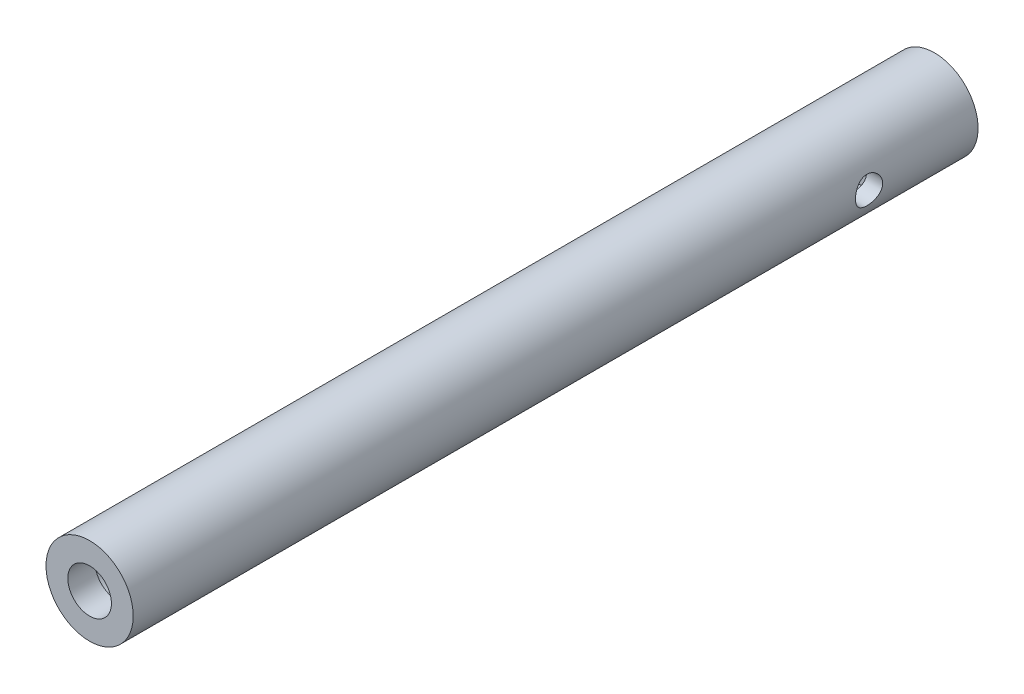
ISO-10303-21;
HEADER;
FILE_DESCRIPTION(('STEP AP214'),'2;1');
FILE_NAME('part.step','',(''),(''),'','','');
FILE_SCHEMA(('AUTOMOTIVE_DESIGN { 1 0 10303 214 1 1 1 1 }'));
ENDSEC;
DATA;
#1=APPLICATION_CONTEXT('core data for automotive mechanical design processes');
#2=APPLICATION_PROTOCOL_DEFINITION('international standard','automotive_design',2000,#1);
#3=PRODUCT_CONTEXT('',#1,'mechanical');
#4=PRODUCT('Part','Part','',(#3));
#5=PRODUCT_RELATED_PRODUCT_CATEGORY('part','',(#4));
#6=PRODUCT_DEFINITION_FORMATION('','',#4);
#7=PRODUCT_DEFINITION_CONTEXT('part definition',#1,'design');
#8=PRODUCT_DEFINITION('design','',#6,#7);
#9=PRODUCT_DEFINITION_SHAPE('','',#8);
#10=(LENGTH_UNIT() NAMED_UNIT(*) SI_UNIT(.MILLI.,.METRE.));
#11=(NAMED_UNIT(*) PLANE_ANGLE_UNIT() SI_UNIT($,.RADIAN.));
#12=(NAMED_UNIT(*) SI_UNIT($,.STERADIAN.) SOLID_ANGLE_UNIT());
#13=UNCERTAINTY_MEASURE_WITH_UNIT(LENGTH_MEASURE(1.E-05),#10,'distance_accuracy_value','');
#14=(GEOMETRIC_REPRESENTATION_CONTEXT(3) GLOBAL_UNCERTAINTY_ASSIGNED_CONTEXT((#13)) GLOBAL_UNIT_ASSIGNED_CONTEXT((#10,
#11,#12)) REPRESENTATION_CONTEXT('',''));
#15=CARTESIAN_POINT('',(0.,0.,0.));
#16=DIRECTION('',(0.,0.,1.));
#17=DIRECTION('',(1.,0.,0.));
#18=AXIS2_PLACEMENT_3D('',#15,#16,#17);
#19=CARTESIAN_POINT('',(0.,0.,150.));
#20=DIRECTION('',(0.,0.,-1.));
#21=DIRECTION('',(-1.,0.,0.));
#22=AXIS2_PLACEMENT_3D('',#19,#20,#21);
#23=CYLINDRICAL_SURFACE('',#22,8.);
#24=CARTESIAN_POINT('',(-8.,0.,12.5));
#25=CARTESIAN_POINT('',(-7.9999993175598,0.136878370349092,12.5000008931751));
#26=CARTESIAN_POINT('',(-7.99645389969682,0.273766105005718,12.5112784538889));
#27=CARTESIAN_POINT('',(-7.98265788177613,0.543538419176896,12.5559724830785));
#28=CARTESIAN_POINT('',(-7.97240576399719,0.676422085451814,12.5893939627287));
#29=CARTESIAN_POINT('',(-7.94631631395819,0.934257087301612,12.6771387423915));
#30=CARTESIAN_POINT('',(-7.9304876299805,1.05922035397161,12.7314296893059));
#31=CARTESIAN_POINT('',(-7.89487938322185,1.29826960469292,12.8592346353566));
#32=CARTESIAN_POINT('',(-7.8750991979981,1.41235387088977,12.9327516635612));
#33=CARTESIAN_POINT('',(-7.83300427480565,1.62993066990456,13.0993119840347));
#34=CARTESIAN_POINT('',(-7.81063431853978,1.73304005631332,13.1928417701221));
#35=CARTESIAN_POINT('',(-7.76620092748417,1.92239476407399,13.3957367848271));
#36=CARTESIAN_POINT('',(-7.74413755046914,2.00863694579739,13.5051049549891));
#37=CARTESIAN_POINT('',(-7.70222289396344,2.16388672966227,13.7398891276161));
#38=CARTESIAN_POINT('',(-7.68243976603591,2.23241568300258,13.8656349550544));
#39=CARTESIAN_POINT('',(-7.64815603598468,2.34719482153343,14.1275846299637));
#40=CARTESIAN_POINT('',(-7.63365404257377,2.39345087543889,14.2637857115878));
#41=CARTESIAN_POINT('',(-7.61215213969001,2.46096919860067,14.5384561549041));
#42=CARTESIAN_POINT('',(-7.60493945859017,2.48294220015729,14.6767336872777));
#43=CARTESIAN_POINT('',(-7.59820110281901,2.50349110073976,14.9551862378238));
#44=CARTESIAN_POINT('',(-7.59867338454668,2.50207321991544,15.0953607416433));
#45=CARTESIAN_POINT('',(-7.60706378150876,2.47643649465479,15.367748920538));
#46=CARTESIAN_POINT('',(-7.61468683491897,2.45312115738766,15.5000582517231));
#47=CARTESIAN_POINT('',(-7.63604051304978,2.38581626711252,15.7587843130747));
#48=CARTESIAN_POINT('',(-7.6497717868623,2.34182451689101,15.8852004154176));
#49=CARTESIAN_POINT('',(-7.68202088028593,2.23377749362554,16.1307038888653));
#50=CARTESIAN_POINT('',(-7.70060569321649,2.16943851324164,16.2496572213839));
#51=CARTESIAN_POINT('',(-7.7404371316014,2.02272041475696,16.4753755357582));
#52=CARTESIAN_POINT('',(-7.76168444789102,1.94033661043154,16.5821373405074));
#53=CARTESIAN_POINT('',(-7.80563055600986,1.75543390836425,16.785549886834));
#54=CARTESIAN_POINT('',(-7.82835139211391,1.65216914118563,16.8815191155593));
#55=CARTESIAN_POINT('',(-7.87183141519161,1.43072881619106,17.0549437871593));
#56=CARTESIAN_POINT('',(-7.89259045676745,1.31255215469804,17.1323978584384));
#57=CARTESIAN_POINT('',(-7.93002589780382,1.06332922093091,17.2670553772025));
#58=CARTESIAN_POINT('',(-7.94666921296415,0.932189813838559,17.3240962709279));
#59=CARTESIAN_POINT('',(-7.97375911657108,0.661535955565289,17.4151060017031));
#60=CARTESIAN_POINT('',(-7.98420758650304,0.522024061449217,17.4490818444768));
#61=CARTESIAN_POINT('',(-7.99742778790027,0.24437031458069,17.4918360851579));
#62=CARTESIAN_POINT('',(-8.00048045790873,0.106383697577686,17.501537087187));
#63=CARTESIAN_POINT('',(-7.99939599461967,-0.169260611465171,17.4980675467253));
#64=CARTESIAN_POINT('',(-7.9952599116227,-0.306918348613018,17.4849003453548));
#65=CARTESIAN_POINT('',(-7.98044727539523,-0.574438665951698,17.4368088147872));
#66=CARTESIAN_POINT('',(-7.96993586221374,-0.704409956841874,17.402433464775));
#67=CARTESIAN_POINT('',(-7.94360242758579,-0.956703857722754,17.3135712952665));
#68=CARTESIAN_POINT('',(-7.92777975028687,-1.07902552089812,17.25908199195));
#69=CARTESIAN_POINT('',(-7.89197085518848,-1.31586481334438,17.1300535669026));
#70=CARTESIAN_POINT('',(-7.87189253635335,-1.43011947957558,17.0550580250064));
#71=CARTESIAN_POINT('',(-7.82986820006859,-1.64473170192052,16.8876935797651));
#72=CARTESIAN_POINT('',(-7.80792167695774,-1.7450854760879,16.7953199645107));
#73=CARTESIAN_POINT('',(-7.76353989766283,-1.93317492583804,16.5914822198958));
#74=CARTESIAN_POINT('',(-7.74111973412883,-2.02025304679063,16.4794066725215));
#75=CARTESIAN_POINT('',(-7.69923894191212,-2.17442500490303,16.2417467672464));
#76=CARTESIAN_POINT('',(-7.67977826622621,-2.24151915946859,16.116162623946));
#77=CARTESIAN_POINT('',(-7.64623564661738,-2.35340166961085,15.855309654259));
#78=CARTESIAN_POINT('',(-7.63213292713749,-2.39827639112025,15.7200807011285));
#79=CARTESIAN_POINT('',(-7.6110234168862,-2.4644578863618,15.4434550135027));
#80=CARTESIAN_POINT('',(-7.60401392602456,-2.48577362827989,15.3020606473129));
#81=CARTESIAN_POINT('',(-7.59816585427753,-2.50358812316251,15.0239918248391));
#82=CARTESIAN_POINT('',(-7.59897209200284,-2.50116559243271,14.8873930923051));
#83=CARTESIAN_POINT('',(-7.60780180751807,-2.47417636257668,14.6166508301161));
#84=CARTESIAN_POINT('',(-7.61582494863208,-2.44961069645024,14.4825071862265));
#85=CARTESIAN_POINT('',(-7.6379362836678,-2.37975459827235,14.2224119208162));
#86=CARTESIAN_POINT('',(-7.65193396380513,-2.33477284812017,14.0963691178133));
#87=CARTESIAN_POINT('',(-7.68439408509128,-2.22560454669999,13.853519172932));
#88=CARTESIAN_POINT('',(-7.70285743429343,-2.16141408888474,13.7367139158432));
#89=CARTESIAN_POINT('',(-7.74306974067005,-2.01271350026987,13.5107080591204));
#90=CARTESIAN_POINT('',(-7.76491897845913,-1.92750667048265,13.4019837409995));
#91=CARTESIAN_POINT('',(-7.8089799764242,-1.7404179928096,13.200027343776));
#92=CARTESIAN_POINT('',(-7.83119183213309,-1.63853168468878,13.1067994220179));
#93=CARTESIAN_POINT('',(-7.87434543904947,-1.41697332564669,12.9354349232741));
#94=CARTESIAN_POINT('',(-7.89522203461346,-1.29682914897477,12.8578905271001));
#95=CARTESIAN_POINT('',(-7.93253538593756,-1.0445582760273,12.7242021697211));
#96=CARTESIAN_POINT('',(-7.94897388631644,-0.912436315590897,12.6680497957163));
#97=CARTESIAN_POINT('',(-7.97441301466941,-0.651495270747958,12.5828172647831));
#98=CARTESIAN_POINT('',(-7.98392481612283,-0.523340674225093,12.5518502653893));
#99=CARTESIAN_POINT('',(-7.99671800680967,-0.263459790880496,12.5104432800646));
#100=CARTESIAN_POINT('',(-8.00000065679286,-0.13173423227935,12.499999140392));
#101=CARTESIAN_POINT('',(-8.,0.,12.5));
#102=B_SPLINE_CURVE_WITH_KNOTS('',3,(#24,#25,#26,#27,#28,#29,#30,#31,#32,#33,#34,#35,#36,#37,
#38,#39,#40,#41,#42,#43,#44,#45,#46,#47,#48,#49,#50,#51,#52,#53,#54,#55,#56,#57,#58,#59,#60,#61,
#62,#63,#64,#65,#66,#67,#68,#69,#70,#71,#72,#73,#74,#75,#76,#77,#78,#79,#80,#81,#82,#83,#84,#85,
#86,#87,#88,#89,#90,#91,#92,#93,#94,#95,#96,#97,#98,#99,#100,#101),.UNSPECIFIED.,.T.,.F.,(4,2,2,
2,2,2,2,2,2,2,2,2,2,2,2,2,2,2,2,2,2,2,2,2,2,2,2,2,2,2,2,2,2,2,2,2,2,2,4),(0.,0.41015089886502,
0.820394646698132,1.23000495840487,1.63967984311678,2.06075644390316,2.48191134862552,
2.91347542494988,3.34492572559054,3.7633830033442,4.18172900590277,4.58353834844339,
4.98539039958126,5.39311285441091,5.80094132020717,6.22733494559201,6.65376014826607,
7.0835092137954,7.51312768989108,7.92615137096475,8.33911471298726,8.74181253445744,
9.14456010069,9.55712649476687,9.96980491418519,10.3988355742628,10.8278594196742,
11.2552023150671,11.6823824779468,12.0902440696666,12.4980866352126,12.8999582681244,
13.3019116867944,13.7195902803182,14.1373807476578,14.5688133627192,15.0000761335177,
15.3948927332218,15.7896294154519),.UNSPECIFIED.);
#103=CARTESIAN_POINT('',(-8.,0.,12.5));
#104=VERTEX_POINT('',#103);
#105=EDGE_CURVE('E81',#104,#104,#102,.T.);
#106=ORIENTED_EDGE('',*,*,#105,.T.);
#107=EDGE_LOOP('',(#106));
#108=FACE_BOUND('',#107,.T.);
#109=CARTESIAN_POINT('',(8.,0.,12.5));
#110=CARTESIAN_POINT('',(7.9999993175598,-0.136878370349093,12.5000008931751));
#111=CARTESIAN_POINT('',(7.99645389969682,-0.273766105005718,12.5112784538889));
#112=CARTESIAN_POINT('',(7.98265788177613,-0.543538419176896,12.5559724830785));
#113=CARTESIAN_POINT('',(7.97240576399719,-0.676422085451814,12.5893939627287));
#114=CARTESIAN_POINT('',(7.94631631395819,-0.934257087301613,12.6771387423915));
#115=CARTESIAN_POINT('',(7.9304876299805,-1.05922035397161,12.7314296893059));
#116=CARTESIAN_POINT('',(7.89487938322185,-1.29826960469292,12.8592346353566));
#117=CARTESIAN_POINT('',(7.8750991979981,-1.41235387088977,12.9327516635612));
#118=CARTESIAN_POINT('',(7.83300427480565,-1.62993066990456,13.0993119840347));
#119=CARTESIAN_POINT('',(7.81063431853978,-1.73304005631332,13.1928417701221));
#120=CARTESIAN_POINT('',(7.76620092748417,-1.92239476407399,13.3957367848271));
#121=CARTESIAN_POINT('',(7.74413755046914,-2.00863694579739,13.5051049549891));
#122=CARTESIAN_POINT('',(7.70222289396344,-2.16388672966227,13.7398891276161));
#123=CARTESIAN_POINT('',(7.68243976603591,-2.23241568300258,13.8656349550544));
#124=CARTESIAN_POINT('',(7.64815603598468,-2.34719482153343,14.1275846299637));
#125=CARTESIAN_POINT('',(7.63365404257377,-2.39345087543889,14.2637857115878));
#126=CARTESIAN_POINT('',(7.61215213969001,-2.46096919860067,14.5384561549041));
#127=CARTESIAN_POINT('',(7.60493945859016,-2.48294220015729,14.6767336872777));
#128=CARTESIAN_POINT('',(7.59820110281901,-2.50349110073976,14.9551862378238));
#129=CARTESIAN_POINT('',(7.59867338454668,-2.50207321991544,15.0953607416433));
#130=CARTESIAN_POINT('',(7.60706378150876,-2.47643649465479,15.3677489205379));
#131=CARTESIAN_POINT('',(7.61468683491897,-2.45312115738766,15.5000582517231));
#132=CARTESIAN_POINT('',(7.63604051304978,-2.38581626711252,15.7587843130747));
#133=CARTESIAN_POINT('',(7.64977178686229,-2.34182451689101,15.8852004154176));
#134=CARTESIAN_POINT('',(7.68202088028593,-2.23377749362555,16.1307038888653));
#135=CARTESIAN_POINT('',(7.70060569321649,-2.16943851324164,16.2496572213839));
#136=CARTESIAN_POINT('',(7.7404371316014,-2.02272041475697,16.4753755357582));
#137=CARTESIAN_POINT('',(7.76168444789102,-1.94033661043155,16.5821373405074));
#138=CARTESIAN_POINT('',(7.80563055600986,-1.75543390836425,16.785549886834));
#139=CARTESIAN_POINT('',(7.82835139211391,-1.65216914118564,16.8815191155593));
#140=CARTESIAN_POINT('',(7.8718314151916,-1.43072881619106,17.0549437871593));
#141=CARTESIAN_POINT('',(7.89259045676745,-1.31255215469804,17.1323978584384));
#142=CARTESIAN_POINT('',(7.93002589780382,-1.06332922093091,17.2670553772025));
#143=CARTESIAN_POINT('',(7.94666921296415,-0.932189813838562,17.3240962709279));
#144=CARTESIAN_POINT('',(7.97375911657108,-0.661535955565292,17.4151060017031));
#145=CARTESIAN_POINT('',(7.98420758650304,-0.522024061449221,17.4490818444768));
#146=CARTESIAN_POINT('',(7.99742778790027,-0.244370314580693,17.4918360851579));
#147=CARTESIAN_POINT('',(8.00048045790873,-0.106383697577689,17.501537087187));
#148=CARTESIAN_POINT('',(7.99939599461967,0.169260611465169,17.4980675467253));
#149=CARTESIAN_POINT('',(7.9952599116227,0.306918348613015,17.4849003453548));
#150=CARTESIAN_POINT('',(7.98044727539523,0.574438665951695,17.4368088147872));
#151=CARTESIAN_POINT('',(7.96993586221374,0.704409956841872,17.402433464775));
#152=CARTESIAN_POINT('',(7.94360242758579,0.956703857722752,17.3135712952666));
#153=CARTESIAN_POINT('',(7.92777975028687,1.07902552089811,17.25908199195));
#154=CARTESIAN_POINT('',(7.89197085518848,1.31586481334437,17.1300535669026));
#155=CARTESIAN_POINT('',(7.87189253635335,1.43011947957558,17.0550580250064));
#156=CARTESIAN_POINT('',(7.82986820006859,1.64473170192052,16.8876935797651));
#157=CARTESIAN_POINT('',(7.80792167695774,1.7450854760879,16.7953199645107));
#158=CARTESIAN_POINT('',(7.76353989766283,1.93317492583804,16.5914822198958));
#159=CARTESIAN_POINT('',(7.74111973412883,2.02025304679062,16.4794066725215));
#160=CARTESIAN_POINT('',(7.69923894191212,2.17442500490303,16.2417467672464));
#161=CARTESIAN_POINT('',(7.67977826622621,2.24151915946859,16.116162623946));
#162=CARTESIAN_POINT('',(7.64623564661738,2.35340166961084,15.855309654259));
#163=CARTESIAN_POINT('',(7.63213292713749,2.39827639112025,15.7200807011285));
#164=CARTESIAN_POINT('',(7.6110234168862,2.4644578863618,15.4434550135027));
#165=CARTESIAN_POINT('',(7.60401392602456,2.48577362827989,15.3020606473129));
#166=CARTESIAN_POINT('',(7.59816585427753,2.50358812316251,15.0239918248391));
#167=CARTESIAN_POINT('',(7.59897209200284,2.50116559243271,14.8873930923051));
#168=CARTESIAN_POINT('',(7.60780180751807,2.47417636257668,14.6166508301161));
#169=CARTESIAN_POINT('',(7.61582494863208,2.44961069645024,14.4825071862265));
#170=CARTESIAN_POINT('',(7.6379362836678,2.37975459827235,14.2224119208162));
#171=CARTESIAN_POINT('',(7.65193396380513,2.33477284812017,14.0963691178133));
#172=CARTESIAN_POINT('',(7.68439408509128,2.22560454669999,13.853519172932));
#173=CARTESIAN_POINT('',(7.70285743429343,2.16141408888474,13.7367139158432));
#174=CARTESIAN_POINT('',(7.74306974067005,2.01271350026987,13.5107080591204));
#175=CARTESIAN_POINT('',(7.76491897845913,1.92750667048265,13.4019837409995));
#176=CARTESIAN_POINT('',(7.8089799764242,1.7404179928096,13.200027343776));
#177=CARTESIAN_POINT('',(7.83119183213309,1.63853168468878,13.1067994220179));
#178=CARTESIAN_POINT('',(7.87434543904947,1.41697332564669,12.9354349232741));
#179=CARTESIAN_POINT('',(7.89522203461346,1.29682914897477,12.8578905271001));
#180=CARTESIAN_POINT('',(7.93253538593756,1.0445582760273,12.7242021697211));
#181=CARTESIAN_POINT('',(7.94897388631644,0.912436315590897,12.6680497957163));
#182=CARTESIAN_POINT('',(7.97441301466941,0.651495270747957,12.5828172647831));
#183=CARTESIAN_POINT('',(7.98392481612283,0.523340674225092,12.5518502653893));
#184=CARTESIAN_POINT('',(7.99671800680967,0.263459790880495,12.5104432800646));
#185=CARTESIAN_POINT('',(8.00000065679286,0.131734232279349,12.499999140392));
#186=CARTESIAN_POINT('',(8.,0.,12.5));
#187=B_SPLINE_CURVE_WITH_KNOTS('',3,(#109,#110,#111,#112,#113,#114,#115,#116,#117,#118,#119,
#120,#121,#122,#123,#124,#125,#126,#127,#128,#129,#130,#131,#132,#133,#134,#135,#136,#137,#138,
#139,#140,#141,#142,#143,#144,#145,#146,#147,#148,#149,#150,#151,#152,#153,#154,#155,#156,#157,
#158,#159,#160,#161,#162,#163,#164,#165,#166,#167,#168,#169,#170,#171,#172,#173,#174,#175,#176,
#177,#178,#179,#180,#181,#182,#183,#184,#185,#186),.UNSPECIFIED.,.T.,.F.,(4,2,2,2,2,2,2,2,2,2,2,
2,2,2,2,2,2,2,2,2,2,2,2,2,2,2,2,2,2,2,2,2,2,2,2,2,2,2,4),(0.,0.41015089886502,0.820394646698133,
1.23000495840487,1.63967984311678,2.06075644390317,2.48191134862552,2.91347542494988,
3.34492572559054,3.7633830033442,4.18172900590277,4.58353834844338,4.98539039958126,
5.3931128544109,5.80094132020717,6.227334945592,6.65376014826606,7.0835092137954,
7.51312768989108,7.92615137096475,8.33911471298726,8.74181253445744,9.14456010069,
9.55712649476687,9.96980491418519,10.3988355742628,10.8278594196742,11.2552023150671,
11.6823824779468,12.0902440696666,12.4980866352126,12.8999582681244,13.3019116867944,
13.7195902803182,14.1373807476578,14.5688133627192,15.0000761335177,15.3948927332218,
15.7896294154519),.UNSPECIFIED.);
#188=CARTESIAN_POINT('',(8.,0.,12.5));
#189=VERTEX_POINT('',#188);
#190=EDGE_CURVE('E76',#189,#189,#187,.T.);
#191=ORIENTED_EDGE('',*,*,#190,.T.);
#192=EDGE_LOOP('',(#191));
#193=FACE_BOUND('',#192,.T.);
#194=CARTESIAN_POINT('',(0.,0.,150.));
#195=DIRECTION('',(0.,0.,1.));
#196=DIRECTION('',(1.,0.,0.));
#197=AXIS2_PLACEMENT_3D('',#194,#195,#196);
#198=CIRCLE('',#197,8.);
#199=CARTESIAN_POINT('',(8.,0.,150.));
#200=VERTEX_POINT('',#199);
#201=EDGE_CURVE('E10',#200,#200,#198,.T.);
#202=ORIENTED_EDGE('',*,*,#201,.F.);
#203=EDGE_LOOP('',(#202));
#204=FACE_BOUND('',#203,.T.);
#205=CARTESIAN_POINT('',(0.,0.,-5.));
#206=DIRECTION('',(0.,0.,-1.));
#207=DIRECTION('',(-1.,0.,0.));
#208=AXIS2_PLACEMENT_3D('',#205,#206,#207);
#209=CIRCLE('',#208,8.);
#210=CARTESIAN_POINT('',(-8.,0.,-5.));
#211=VERTEX_POINT('',#210);
#212=EDGE_CURVE('E56',#211,#211,#209,.T.);
#213=ORIENTED_EDGE('',*,*,#212,.F.);
#214=EDGE_LOOP('',(#213));
#215=FACE_BOUND('',#214,.T.);
#216=ADVANCED_FACE('F32',(#108,#193,#204,#215),#23,.T.);
#217=CARTESIAN_POINT('',(0.,0.,150.));
#218=DIRECTION('',(0.,0.,1.));
#219=DIRECTION('',(1.,0.,0.));
#220=AXIS2_PLACEMENT_3D('',#217,#218,#219);
#221=PLANE('',#220);
#222=CARTESIAN_POINT('',(0.,0.,150.));
#223=DIRECTION('',(0.,0.,1.));
#224=DIRECTION('',(1.,0.,0.));
#225=AXIS2_PLACEMENT_3D('',#222,#223,#224);
#226=CIRCLE('',#225,4.);
#227=CARTESIAN_POINT('',(4.,0.,150.));
#228=VERTEX_POINT('',#227);
#229=EDGE_CURVE('E44',#228,#228,#226,.T.);
#230=ORIENTED_EDGE('',*,*,#229,.F.);
#231=EDGE_LOOP('',(#230));
#232=FACE_BOUND('',#231,.T.);
#233=ORIENTED_EDGE('',*,*,#201,.T.);
#234=EDGE_LOOP('',(#233));
#235=FACE_BOUND('',#234,.T.);
#236=ADVANCED_FACE('F106',(#232,#235),#221,.T.);
#237=CARTESIAN_POINT('',(0.,0.,145.));
#238=DIRECTION('',(0.,0.,1.));
#239=DIRECTION('',(1.,0.,0.));
#240=AXIS2_PLACEMENT_3D('',#237,#238,#239);
#241=CYLINDRICAL_SURFACE('',#240,4.);
#242=CARTESIAN_POINT('',(0.,0.,145.));
#243=DIRECTION('',(0.,0.,1.));
#244=DIRECTION('',(1.,0.,0.));
#245=AXIS2_PLACEMENT_3D('',#242,#243,#244);
#246=CIRCLE('',#245,4.);
#247=CARTESIAN_POINT('',(4.,0.,145.));
#248=VERTEX_POINT('',#247);
#249=EDGE_CURVE('E49',#248,#248,#246,.F.);
#250=ORIENTED_EDGE('',*,*,#249,.T.);
#251=EDGE_LOOP('',(#250));
#252=FACE_BOUND('',#251,.T.);
#253=ORIENTED_EDGE('',*,*,#229,.T.);
#254=EDGE_LOOP('',(#253));
#255=FACE_BOUND('',#254,.T.);
#256=ADVANCED_FACE('F95',(#252,#255),#241,.F.);
#257=CARTESIAN_POINT('',(0.,0.,145.));
#258=DIRECTION('',(0.,0.,1.));
#259=DIRECTION('',(1.,0.,0.));
#260=AXIS2_PLACEMENT_3D('',#257,#258,#259);
#261=PLANE('',#260);
#262=CARTESIAN_POINT('',(0.,0.,145.));
#263=DIRECTION('',(0.,0.,1.));
#264=DIRECTION('',(1.,0.,0.));
#265=AXIS2_PLACEMENT_3D('',#262,#263,#264);
#266=CIRCLE('',#265,5.);
#267=CARTESIAN_POINT('',(5.,0.,145.));
#268=VERTEX_POINT('',#267);
#269=EDGE_CURVE('E87',#268,#268,#266,.T.);
#270=ORIENTED_EDGE('',*,*,#269,.F.);
#271=EDGE_LOOP('',(#270));
#272=FACE_BOUND('',#271,.T.);
#273=ORIENTED_EDGE('',*,*,#249,.F.);
#274=EDGE_LOOP('',(#273));
#275=FACE_BOUND('',#274,.T.);
#276=ADVANCED_FACE('F98',(#272,#275),#261,.F.);
#277=CARTESIAN_POINT('',(0.,0.,9.99999999999998));
#278=DIRECTION('',(0.,0.,1.));
#279=DIRECTION('',(1.,0.,0.));
#280=AXIS2_PLACEMENT_3D('',#277,#278,#279);
#281=CYLINDRICAL_SURFACE('',#280,5.);
#282=CARTESIAN_POINT('',(5.,0.,12.5));
#283=CARTESIAN_POINT('',(4.99999177550472,0.131426682334305,12.500009669056));
#284=CARTESIAN_POINT('',(4.99476199135277,0.263015634437213,12.510425561774));
#285=CARTESIAN_POINT('',(4.9743541856102,0.522301454622883,12.551631821162));
#286=CARTESIAN_POINT('',(4.9591572718767,0.649990448564105,12.582460880925));
#287=CARTESIAN_POINT('',(4.92040690922477,0.897333631316203,12.6629846227188));
#288=CARTESIAN_POINT('',(4.89688595907259,1.01701694536277,12.7126059877827));
#289=CARTESIAN_POINT('',(4.84364443325827,1.24618160399671,12.8289265262518));
#290=CARTESIAN_POINT('',(4.81392434644421,1.3556637520377,12.8956243531451));
#291=CARTESIAN_POINT('',(4.74890645050632,1.56876952630998,13.0487931316426));
#292=CARTESIAN_POINT('',(4.71337997659091,1.67163802294308,13.1362162002298));
#293=CARTESIAN_POINT('',(4.64149925776731,1.86194861703332,13.3263036959853));
#294=CARTESIAN_POINT('',(4.60514440566897,1.94937895911555,13.4289796288401));
#295=CARTESIAN_POINT('',(4.53247377945622,2.11312999967247,13.6562083744453));
#296=CARTESIAN_POINT('',(4.49637967412567,2.18806333849064,13.781840246035));
#297=CARTESIAN_POINT('',(4.43214946943555,2.31542056761491,14.0459183397954));
#298=CARTESIAN_POINT('',(4.40400769020792,2.36786053751682,14.1843553217626));
#299=CARTESIAN_POINT('',(4.36144667591402,2.44533110537653,14.4616627635964));
#300=CARTESIAN_POINT('',(4.34630678958452,2.47181464267578,14.6000111301796));
#301=CARTESIAN_POINT('',(4.3295472487215,2.50106748329741,14.8799470944376));
#302=CARTESIAN_POINT('',(4.3279142335843,2.50386022093906,15.0215313521751));
#303=CARTESIAN_POINT('',(4.33777325642937,2.48671821792512,15.2857150607909));
#304=CARTESIAN_POINT('',(4.34771909154984,2.46946139884055,15.4085600780583));
#305=CARTESIAN_POINT('',(4.37690571834675,2.41734962264384,15.6493047734319));
#306=CARTESIAN_POINT('',(4.39614947079454,2.38248905974454,15.7672028632631));
#307=CARTESIAN_POINT('',(4.44218691031839,2.29552445096459,15.9980728314143));
#308=CARTESIAN_POINT('',(4.46914601659993,2.24303766778987,16.1108659969645));
#309=CARTESIAN_POINT('',(4.52758510703513,2.12260421917012,16.326585731475));
#310=CARTESIAN_POINT('',(4.55906711950478,2.0546506095312,16.4295078390002));
#311=CARTESIAN_POINT('',(4.62782894758213,1.89516513728194,16.6363031318581));
#312=CARTESIAN_POINT('',(4.66533775591865,1.8017361459232,16.7386421839404));
#313=CARTESIAN_POINT('',(4.73869058251019,1.59888894685344,16.9268385464772));
#314=CARTESIAN_POINT('',(4.77453379897003,1.48946314143571,17.0126879800847));
#315=CARTESIAN_POINT('',(4.84254968207409,1.25129126457962,17.1692141525743));
#316=CARTESIAN_POINT('',(4.87447460405015,1.12188397899853,17.2390011811143));
#317=CARTESIAN_POINT('',(4.92894702803109,0.851165538721983,17.3552425726075));
#318=CARTESIAN_POINT('',(4.95150197358893,0.70986394066316,17.4017154625379));
#319=CARTESIAN_POINT('',(4.98310834353579,0.431916229151777,17.4661885092917));
#320=CARTESIAN_POINT('',(4.9931234575324,0.295853826370902,17.486228089367));
#321=CARTESIAN_POINT('',(5.00182533647794,0.0219489998732847,17.5036618278362));
#322=CARTESIAN_POINT('',(5.00051746803426,-0.115892549675113,17.5010667140985));
#323=CARTESIAN_POINT('',(4.98727980633468,-0.37808242996466,17.4744832789533));
#324=CARTESIAN_POINT('',(4.97618114219992,-0.50264852012371,17.4521686681756));
#325=CARTESIAN_POINT('',(4.94555428287529,-0.746017230755975,17.3894048202616));
#326=CARTESIAN_POINT('',(4.92602515837625,-0.864819214231886,17.3489535838641));
#327=CARTESIAN_POINT('',(4.87960628532329,-1.09722152111965,17.2500038339196));
#328=CARTESIAN_POINT('',(4.85252204417873,-1.21057599249831,17.1910223747177));
#329=CARTESIAN_POINT('',(4.7935993579975,-1.42615340426439,17.0572311608752));
#330=CARTESIAN_POINT('',(4.76175888940534,-1.52837157450204,16.9824146634801));
#331=CARTESIAN_POINT('',(4.69270553315086,-1.72941922315487,16.8105989367091));
#332=CARTESIAN_POINT('',(4.65527212009488,-1.82693019428496,16.7121428290248));
#333=CARTESIAN_POINT('',(4.58155978921587,-2.0046408025722,16.5001871219505));
#334=CARTESIAN_POINT('',(4.54528168472407,-2.08482846428685,16.3866772029301));
#335=CARTESIAN_POINT('',(4.4762798054528,-2.22926978618995,16.1408908645153));
#336=CARTESIAN_POINT('',(4.44381323981254,-2.29256373922244,16.0079718347088));
#337=CARTESIAN_POINT('',(4.38935180726746,-2.39520706511459,15.7312248311174));
#338=CARTESIAN_POINT('',(4.36734345549014,-2.43458729077056,15.587411184));
#339=CARTESIAN_POINT('',(4.33903752569351,-2.48465421767005,15.307724442637));
#340=CARTESIAN_POINT('',(4.33143458674096,-2.4977324874436,15.172414365881));
#341=CARTESIAN_POINT('',(4.32913386592579,-2.50172288950898,14.9013823326193));
#342=CARTESIAN_POINT('',(4.3344304902511,-2.49264462983266,14.7656605801263));
#343=CARTESIAN_POINT('',(4.35594655164663,-2.45481530197332,14.5112912443831));
#344=CARTESIAN_POINT('',(4.37107736338133,-2.42802074302696,14.3922488182792));
#345=CARTESIAN_POINT('',(4.40927540337602,-2.35793843840544,14.1604797078));
#346=CARTESIAN_POINT('',(4.43234518434965,-2.31464538728732,14.0477550684334));
#347=CARTESIAN_POINT('',(4.48571326433413,-2.20953919315538,13.8234378472803));
#348=CARTESIAN_POINT('',(4.5163930799845,-2.14667719009403,13.712430148265));
#349=CARTESIAN_POINT('',(4.58088327077455,-2.0053780838799,13.5018137567599));
#350=CARTESIAN_POINT('',(4.61469526970767,-1.92693287765888,13.4022110373713));
#351=CARTESIAN_POINT('',(4.68655816327011,-1.74550556946065,13.2046446362503));
#352=CARTESIAN_POINT('',(4.7246249151498,-1.64070022469209,13.1083506358286));
#353=CARTESIAN_POINT('',(4.79694347383545,-1.41539785420684,12.9343441505719));
#354=CARTESIAN_POINT('',(4.83119321905446,-1.29489242426332,12.8566416813941));
#355=CARTESIAN_POINT('',(4.89245149457782,-1.03978808878536,12.7219030205159));
#356=CARTESIAN_POINT('',(4.91940711437488,-0.905095560782286,12.6650168322155));
#357=CARTESIAN_POINT('',(4.95177960923351,-0.69632870925735,12.5978161412076));
#358=CARTESIAN_POINT('',(4.96122314081874,-0.625670413494086,12.5784446019982));
#359=CARTESIAN_POINT('',(4.97717127275101,-0.482623997839255,12.5459340516294));
#360=CARTESIAN_POINT('',(4.98367766823159,-0.410236963092399,12.5327912333236));
#361=CARTESIAN_POINT('',(4.9923820076613,-0.28151868462167,12.5152625277154));
#362=CARTESIAN_POINT('',(4.99523288466454,-0.225408499555443,12.5095450634687));
#363=CARTESIAN_POINT('',(4.99904367329659,-0.112875528456288,12.5019116705343));
#364=CARTESIAN_POINT('',(5.00000353273198,-0.0564527338382177,12.4999958467745));
#365=CARTESIAN_POINT('',(5.,0.,12.5));
#366=B_SPLINE_CURVE_WITH_KNOTS('',3,(#282,#283,#284,#285,#286,#287,#288,#289,#290,#291,#292,
#293,#294,#295,#296,#297,#298,#299,#300,#301,#302,#303,#304,#305,#306,#307,#308,#309,#310,#311,
#312,#313,#314,#315,#316,#317,#318,#319,#320,#321,#322,#323,#324,#325,#326,#327,#328,#329,#330,
#331,#332,#333,#334,#335,#336,#337,#338,#339,#340,#341,#342,#343,#344,#345,#346,#347,#348,#349,
#350,#351,#352,#353,#354,#355,#356,#357,#358,#359,#360,#361,#362,#363,#364,#365),.UNSPECIFIED.,
.T.,.F.,(4,2,2,2,2,2,2,2,2,2,2,2,2,2,2,2,2,2,2,2,2,2,2,2,2,2,2,2,2,2,2,2,2,2,2,2,2,2,2,2,2,4),
(0.,0.394060643550731,0.788870374272994,1.18215538873075,1.57540940145392,1.99245439679522,
2.40981559413509,2.85954316076882,3.30894869745702,3.73145030350574,4.15353393322551,
4.52514281023301,4.89687009814196,5.27725600421219,5.65781303150554,6.08662353334696,
6.51563836496716,6.96457555536101,7.41315542280699,7.82458226178364,8.2358141127869,
8.61517266265305,8.99457304077329,9.38482140069747,9.77523626870848,10.2039902661037,
10.6330397153795,11.0828670540368,11.53211279863,11.9382326875699,12.3441764966107,
12.7114482562151,13.0788382197025,13.4709114195009,13.8631890285845,14.303131068923,
14.7433095845248,15.1866003415819,15.407934939208,15.6291340766843,15.7983933645035,
15.9676573239322),.UNSPECIFIED.);
#367=CARTESIAN_POINT('',(5.,0.,12.5));
#368=VERTEX_POINT('',#367);
#369=EDGE_CURVE('E36',#368,#368,#366,.T.);
#370=ORIENTED_EDGE('',*,*,#369,.T.);
#371=EDGE_LOOP('',(#370));
#372=FACE_BOUND('',#371,.T.);
#373=CARTESIAN_POINT('',(-5.,0.,12.5));
#374=CARTESIAN_POINT('',(-4.99999177550472,-0.131426682334305,12.500009669056));
#375=CARTESIAN_POINT('',(-4.99476199135277,-0.263015634437213,12.510425561774));
#376=CARTESIAN_POINT('',(-4.9743541856102,-0.522301454622883,12.551631821162));
#377=CARTESIAN_POINT('',(-4.9591572718767,-0.649990448564106,12.582460880925));
#378=CARTESIAN_POINT('',(-4.92040690922477,-0.897333631316204,12.6629846227188));
#379=CARTESIAN_POINT('',(-4.89688595907259,-1.01701694536277,12.7126059877827));
#380=CARTESIAN_POINT('',(-4.84364443325827,-1.24618160399671,12.8289265262518));
#381=CARTESIAN_POINT('',(-4.81392434644421,-1.3556637520377,12.8956243531451));
#382=CARTESIAN_POINT('',(-4.74890645050632,-1.56876952630998,13.0487931316426));
#383=CARTESIAN_POINT('',(-4.71337997659091,-1.67163802294309,13.1362162002298));
#384=CARTESIAN_POINT('',(-4.64149925776731,-1.86194861703333,13.3263036959853));
#385=CARTESIAN_POINT('',(-4.60514440566897,-1.94937895911556,13.4289796288401));
#386=CARTESIAN_POINT('',(-4.53247377945622,-2.11312999967247,13.6562083744453));
#387=CARTESIAN_POINT('',(-4.49637967412567,-2.18806333849064,13.781840246035));
#388=CARTESIAN_POINT('',(-4.43214946943555,-2.31542056761491,14.0459183397954));
#389=CARTESIAN_POINT('',(-4.40400769020792,-2.36786053751682,14.1843553217626));
#390=CARTESIAN_POINT('',(-4.36144667591402,-2.44533110537653,14.4616627635964));
#391=CARTESIAN_POINT('',(-4.34630678958452,-2.47181464267578,14.6000111301796));
#392=CARTESIAN_POINT('',(-4.3295472487215,-2.50106748329741,14.8799470944376));
#393=CARTESIAN_POINT('',(-4.3279142335843,-2.50386022093906,15.0215313521751));
#394=CARTESIAN_POINT('',(-4.33777325642937,-2.48671821792512,15.2857150607909));
#395=CARTESIAN_POINT('',(-4.34771909154984,-2.46946139884055,15.4085600780583));
#396=CARTESIAN_POINT('',(-4.37690571834675,-2.41734962264384,15.6493047734319));
#397=CARTESIAN_POINT('',(-4.39614947079454,-2.38248905974454,15.7672028632631));
#398=CARTESIAN_POINT('',(-4.44218691031839,-2.29552445096459,15.9980728314143));
#399=CARTESIAN_POINT('',(-4.46914601659993,-2.24303766778987,16.1108659969645));
#400=CARTESIAN_POINT('',(-4.52758510703513,-2.12260421917012,16.326585731475));
#401=CARTESIAN_POINT('',(-4.55906711950478,-2.0546506095312,16.4295078390002));
#402=CARTESIAN_POINT('',(-4.62782894758213,-1.89516513728194,16.6363031318581));
#403=CARTESIAN_POINT('',(-4.66533775591865,-1.8017361459232,16.7386421839404));
#404=CARTESIAN_POINT('',(-4.73869058251019,-1.59888894685344,16.9268385464772));
#405=CARTESIAN_POINT('',(-4.77453379897003,-1.48946314143571,17.0126879800847));
#406=CARTESIAN_POINT('',(-4.84254968207409,-1.25129126457962,17.1692141525743));
#407=CARTESIAN_POINT('',(-4.87447460405015,-1.12188397899853,17.2390011811143));
#408=CARTESIAN_POINT('',(-4.92894702803109,-0.851165538721983,17.3552425726075));
#409=CARTESIAN_POINT('',(-4.95150197358893,-0.709863940663161,17.4017154625379));
#410=CARTESIAN_POINT('',(-4.98310834353579,-0.431916229151779,17.4661885092917));
#411=CARTESIAN_POINT('',(-4.9931234575324,-0.295853826370905,17.486228089367));
#412=CARTESIAN_POINT('',(-5.00182533647794,-0.0219489998732872,17.5036618278362));
#413=CARTESIAN_POINT('',(-5.00051746803426,0.11589254967511,17.5010667140985));
#414=CARTESIAN_POINT('',(-4.98727980633468,0.378082429964657,17.4744832789533));
#415=CARTESIAN_POINT('',(-4.97618114219992,0.502648520123707,17.4521686681756));
#416=CARTESIAN_POINT('',(-4.94555428287529,0.746017230755973,17.3894048202616));
#417=CARTESIAN_POINT('',(-4.92602515837625,0.864819214231884,17.3489535838641));
#418=CARTESIAN_POINT('',(-4.87960628532329,1.09722152111965,17.2500038339196));
#419=CARTESIAN_POINT('',(-4.85252204417873,1.21057599249831,17.1910223747177));
#420=CARTESIAN_POINT('',(-4.7935993579975,1.42615340426439,17.0572311608752));
#421=CARTESIAN_POINT('',(-4.76175888940534,1.52837157450203,16.9824146634801));
#422=CARTESIAN_POINT('',(-4.69270553315087,1.72941922315487,16.8105989367091));
#423=CARTESIAN_POINT('',(-4.65527212009488,1.82693019428496,16.7121428290248));
#424=CARTESIAN_POINT('',(-4.58155978921587,2.0046408025722,16.5001871219505));
#425=CARTESIAN_POINT('',(-4.54528168472407,2.08482846428685,16.3866772029301));
#426=CARTESIAN_POINT('',(-4.4762798054528,2.22926978618995,16.1408908645153));
#427=CARTESIAN_POINT('',(-4.44381323981254,2.29256373922243,16.0079718347088));
#428=CARTESIAN_POINT('',(-4.38935180726746,2.39520706511459,15.7312248311174));
#429=CARTESIAN_POINT('',(-4.36734345549014,2.43458729077055,15.587411184));
#430=CARTESIAN_POINT('',(-4.33903752569351,2.48465421767005,15.307724442637));
#431=CARTESIAN_POINT('',(-4.33143458674096,2.4977324874436,15.172414365881));
#432=CARTESIAN_POINT('',(-4.32913386592579,2.50172288950898,14.9013823326193));
#433=CARTESIAN_POINT('',(-4.33443049025111,2.49264462983266,14.7656605801264));
#434=CARTESIAN_POINT('',(-4.35594655164663,2.45481530197332,14.5112912443831));
#435=CARTESIAN_POINT('',(-4.37107736338133,2.42802074302696,14.3922488182792));
#436=CARTESIAN_POINT('',(-4.40927540337603,2.35793843840543,14.1604797078));
#437=CARTESIAN_POINT('',(-4.43234518434965,2.31464538728732,14.0477550684334));
#438=CARTESIAN_POINT('',(-4.48571326433413,2.20953919315538,13.8234378472803));
#439=CARTESIAN_POINT('',(-4.5163930799845,2.14667719009403,13.712430148265));
#440=CARTESIAN_POINT('',(-4.58088327077455,2.0053780838799,13.5018137567599));
#441=CARTESIAN_POINT('',(-4.61469526970767,1.92693287765888,13.4022110373713));
#442=CARTESIAN_POINT('',(-4.68655816327011,1.74550556946065,13.2046446362503));
#443=CARTESIAN_POINT('',(-4.7246249151498,1.6407002246921,13.1083506358286));
#444=CARTESIAN_POINT('',(-4.79694347383545,1.41539785420684,12.9343441505719));
#445=CARTESIAN_POINT('',(-4.83119321905446,1.29489242426332,12.8566416813941));
#446=CARTESIAN_POINT('',(-4.89245149457782,1.03978808878536,12.7219030205159));
#447=CARTESIAN_POINT('',(-4.91940711437488,0.905095560782287,12.6650168322155));
#448=CARTESIAN_POINT('',(-4.95177960923351,0.69632870925735,12.5978161412076));
#449=CARTESIAN_POINT('',(-4.96122314081874,0.625670413494086,12.5784446019982));
#450=CARTESIAN_POINT('',(-4.97717127275101,0.482623997839256,12.5459340516294));
#451=CARTESIAN_POINT('',(-4.98367766823159,0.4102369630924,12.5327912333236));
#452=CARTESIAN_POINT('',(-4.9923820076613,0.28151868462167,12.5152625277154));
#453=CARTESIAN_POINT('',(-4.99523288466454,0.225408499555443,12.5095450634687));
#454=CARTESIAN_POINT('',(-4.99904367329659,0.112875528456287,12.5019116705343));
#455=CARTESIAN_POINT('',(-5.00000353273198,0.0564527338382169,12.4999958467745));
#456=CARTESIAN_POINT('',(-5.,0.,12.5));
#457=B_SPLINE_CURVE_WITH_KNOTS('',3,(#373,#374,#375,#376,#377,#378,#379,#380,#381,#382,#383,
#384,#385,#386,#387,#388,#389,#390,#391,#392,#393,#394,#395,#396,#397,#398,#399,#400,#401,#402,
#403,#404,#405,#406,#407,#408,#409,#410,#411,#412,#413,#414,#415,#416,#417,#418,#419,#420,#421,
#422,#423,#424,#425,#426,#427,#428,#429,#430,#431,#432,#433,#434,#435,#436,#437,#438,#439,#440,
#441,#442,#443,#444,#445,#446,#447,#448,#449,#450,#451,#452,#453,#454,#455,#456),.UNSPECIFIED.,
.T.,.F.,(4,2,2,2,2,2,2,2,2,2,2,2,2,2,2,2,2,2,2,2,2,2,2,2,2,2,2,2,2,2,2,2,2,2,2,2,2,2,2,2,2,4),
(0.,0.394060643550731,0.788870374272994,1.18215538873075,1.57540940145392,1.99245439679523,
2.40981559413509,2.85954316076882,3.30894869745702,3.73145030350574,4.15353393322551,
4.52514281023301,4.89687009814196,5.27725600421219,5.65781303150554,6.08662353334696,
6.51563836496716,6.96457555536102,7.41315542280699,7.82458226178364,8.2358141127869,
8.61517266265305,8.99457304077329,9.38482140069747,9.77523626870848,10.2039902661037,
10.6330397153795,11.0828670540368,11.53211279863,11.9382326875699,12.3441764966107,
12.7114482562151,13.0788382197025,13.4709114195009,13.8631890285845,14.303131068923,
14.7433095845248,15.1866003415819,15.407934939208,15.6291340766843,15.7983933645035,
15.9676573239322),.UNSPECIFIED.);
#458=CARTESIAN_POINT('',(-5.,0.,12.5));
#459=VERTEX_POINT('',#458);
#460=EDGE_CURVE('E52',#459,#459,#457,.T.);
#461=ORIENTED_EDGE('',*,*,#460,.T.);
#462=EDGE_LOOP('',(#461));
#463=FACE_BOUND('',#462,.T.);
#464=CARTESIAN_POINT('',(0.,0.,9.99999999999998));
#465=DIRECTION('',(0.,0.,1.));
#466=DIRECTION('',(1.,0.,0.));
#467=AXIS2_PLACEMENT_3D('',#464,#465,#466);
#468=CIRCLE('',#467,5.);
#469=CARTESIAN_POINT('',(5.,0.,9.99999999999998));
#470=VERTEX_POINT('',#469);
#471=EDGE_CURVE('E88',#470,#470,#468,.T.);
#472=ORIENTED_EDGE('',*,*,#471,.F.);
#473=EDGE_LOOP('',(#472));
#474=FACE_BOUND('',#473,.T.);
#475=ORIENTED_EDGE('',*,*,#269,.T.);
#476=EDGE_LOOP('',(#475));
#477=FACE_BOUND('',#476,.T.);
#478=ADVANCED_FACE('F57',(#372,#463,#474,#477),#281,.F.);
#479=CARTESIAN_POINT('',(0.,0.,9.99999999999998));
#480=DIRECTION('',(0.,0.,1.));
#481=DIRECTION('',(1.,0.,0.));
#482=AXIS2_PLACEMENT_3D('',#479,#480,#481);
#483=PLANE('',#482);
#484=ORIENTED_EDGE('',*,*,#471,.T.);
#485=EDGE_LOOP('',(#484));
#486=FACE_BOUND('',#485,.T.);
#487=ADVANCED_FACE('F67',(#486),#483,.T.);
#488=CARTESIAN_POINT('',(-8.,0.,15.));
#489=DIRECTION('',(1.,0.,0.));
#490=DIRECTION('',(0.,0.,-1.));
#491=AXIS2_PLACEMENT_3D('',#488,#489,#490);
#492=CYLINDRICAL_SURFACE('',#491,2.5);
#493=ORIENTED_EDGE('',*,*,#460,.F.);
#494=EDGE_LOOP('',(#493));
#495=FACE_BOUND('',#494,.T.);
#496=ORIENTED_EDGE('',*,*,#105,.F.);
#497=EDGE_LOOP('',(#496));
#498=FACE_BOUND('',#497,.T.);
#499=ADVANCED_FACE('F61',(#495,#498),#492,.F.);
#500=ORIENTED_EDGE('',*,*,#369,.F.);
#501=EDGE_LOOP('',(#500));
#502=FACE_BOUND('',#501,.T.);
#503=ORIENTED_EDGE('',*,*,#190,.F.);
#504=EDGE_LOOP('',(#503));
#505=FACE_BOUND('',#504,.T.);
#506=ADVANCED_FACE('F66',(#502,#505),#492,.F.);
#507=CARTESIAN_POINT('',(0.,0.,-5.));
#508=DIRECTION('',(0.,0.,-1.));
#509=DIRECTION('',(-1.,0.,0.));
#510=AXIS2_PLACEMENT_3D('',#507,#508,#509);
#511=PLANE('',#510);
#512=CARTESIAN_POINT('',(0.,0.,-5.));
#513=DIRECTION('',(0.,0.,-1.));
#514=DIRECTION('',(-1.,0.,0.));
#515=AXIS2_PLACEMENT_3D('',#512,#513,#514);
#516=CIRCLE('',#515,5.);
#517=CARTESIAN_POINT('',(-5.,0.,-5.));
#518=VERTEX_POINT('',#517);
#519=EDGE_CURVE('E122',#518,#518,#516,.T.);
#520=ORIENTED_EDGE('',*,*,#519,.F.);
#521=EDGE_LOOP('',(#520));
#522=FACE_BOUND('',#521,.T.);
#523=ORIENTED_EDGE('',*,*,#212,.T.);
#524=EDGE_LOOP('',(#523));
#525=FACE_BOUND('',#524,.T.);
#526=ADVANCED_FACE('F69',(#522,#525),#511,.T.);
#527=CARTESIAN_POINT('',(0.,0.,-3.));
#528=DIRECTION('',(0.,0.,-1.));
#529=DIRECTION('',(-1.,0.,0.));
#530=AXIS2_PLACEMENT_3D('',#527,#528,#529);
#531=CYLINDRICAL_SURFACE('',#530,5.);
#532=CARTESIAN_POINT('',(0.,0.,-3.));
#533=DIRECTION('',(0.,0.,-1.));
#534=DIRECTION('',(-1.,0.,0.));
#535=AXIS2_PLACEMENT_3D('',#532,#533,#534);
#536=CIRCLE('',#535,5.);
#537=CARTESIAN_POINT('',(-5.,0.,-3.));
#538=VERTEX_POINT('',#537);
#539=EDGE_CURVE('E124',#538,#538,#536,.F.);
#540=ORIENTED_EDGE('',*,*,#539,.T.);
#541=EDGE_LOOP('',(#540));
#542=FACE_BOUND('',#541,.T.);
#543=ORIENTED_EDGE('',*,*,#519,.T.);
#544=EDGE_LOOP('',(#543));
#545=FACE_BOUND('',#544,.T.);
#546=ADVANCED_FACE('F148',(#542,#545),#531,.F.);
#547=CARTESIAN_POINT('',(0.,0.,-3.));
#548=DIRECTION('',(0.,0.,-1.));
#549=DIRECTION('',(-1.,0.,0.));
#550=AXIS2_PLACEMENT_3D('',#547,#548,#549);
#551=PLANE('',#550);
#552=CARTESIAN_POINT('',(0.,0.,-3.));
#553=DIRECTION('',(0.,0.,-1.));
#554=DIRECTION('',(-1.,0.,0.));
#555=AXIS2_PLACEMENT_3D('',#552,#553,#554);
#556=CIRCLE('',#555,7.);
#557=CARTESIAN_POINT('',(-7.,0.,-3.));
#558=VERTEX_POINT('',#557);
#559=EDGE_CURVE('E131',#558,#558,#556,.T.);
#560=ORIENTED_EDGE('',*,*,#559,.F.);
#561=EDGE_LOOP('',(#560));
#562=FACE_BOUND('',#561,.T.);
#563=ORIENTED_EDGE('',*,*,#539,.F.);
#564=EDGE_LOOP('',(#563));
#565=FACE_BOUND('',#564,.T.);
#566=ADVANCED_FACE('F142',(#562,#565),#551,.F.);
#567=CARTESIAN_POINT('',(0.,0.,-1.));
#568=DIRECTION('',(0.,0.,-1.));
#569=DIRECTION('',(-1.,0.,0.));
#570=AXIS2_PLACEMENT_3D('',#567,#568,#569);
#571=CYLINDRICAL_SURFACE('',#570,7.);
#572=CARTESIAN_POINT('',(0.,0.,-1.));
#573=DIRECTION('',(0.,0.,-1.));
#574=DIRECTION('',(-1.,0.,0.));
#575=AXIS2_PLACEMENT_3D('',#572,#573,#574);
#576=CIRCLE('',#575,7.);
#577=CARTESIAN_POINT('',(-7.,0.,-1.));
#578=VERTEX_POINT('',#577);
#579=EDGE_CURVE('E128',#578,#578,#576,.T.);
#580=ORIENTED_EDGE('',*,*,#579,.F.);
#581=EDGE_LOOP('',(#580));
#582=FACE_BOUND('',#581,.T.);
#583=ORIENTED_EDGE('',*,*,#559,.T.);
#584=EDGE_LOOP('',(#583));
#585=FACE_BOUND('',#584,.T.);
#586=ADVANCED_FACE('F139',(#582,#585),#571,.F.);
#587=CARTESIAN_POINT('',(0.,0.,-1.));
#588=DIRECTION('',(0.,0.,-1.));
#589=DIRECTION('',(-1.,0.,0.));
#590=AXIS2_PLACEMENT_3D('',#587,#588,#589);
#591=PLANE('',#590);
#592=ORIENTED_EDGE('',*,*,#579,.T.);
#593=EDGE_LOOP('',(#592));
#594=FACE_BOUND('',#593,.T.);
#595=ADVANCED_FACE('F137',(#594),#591,.T.);
#596=CLOSED_SHELL('',(#216,#236,#256,#276,#478,#487,#499,#506,#526,#546,#566,#586,#595));
#597=MANIFOLD_SOLID_BREP('B2',#596);
#598=ADVANCED_BREP_SHAPE_REPRESENTATION('',(#18,#597),#14);
#599=SHAPE_DEFINITION_REPRESENTATION(#9,#598);
ENDSEC;
END-ISO-10303-21;
